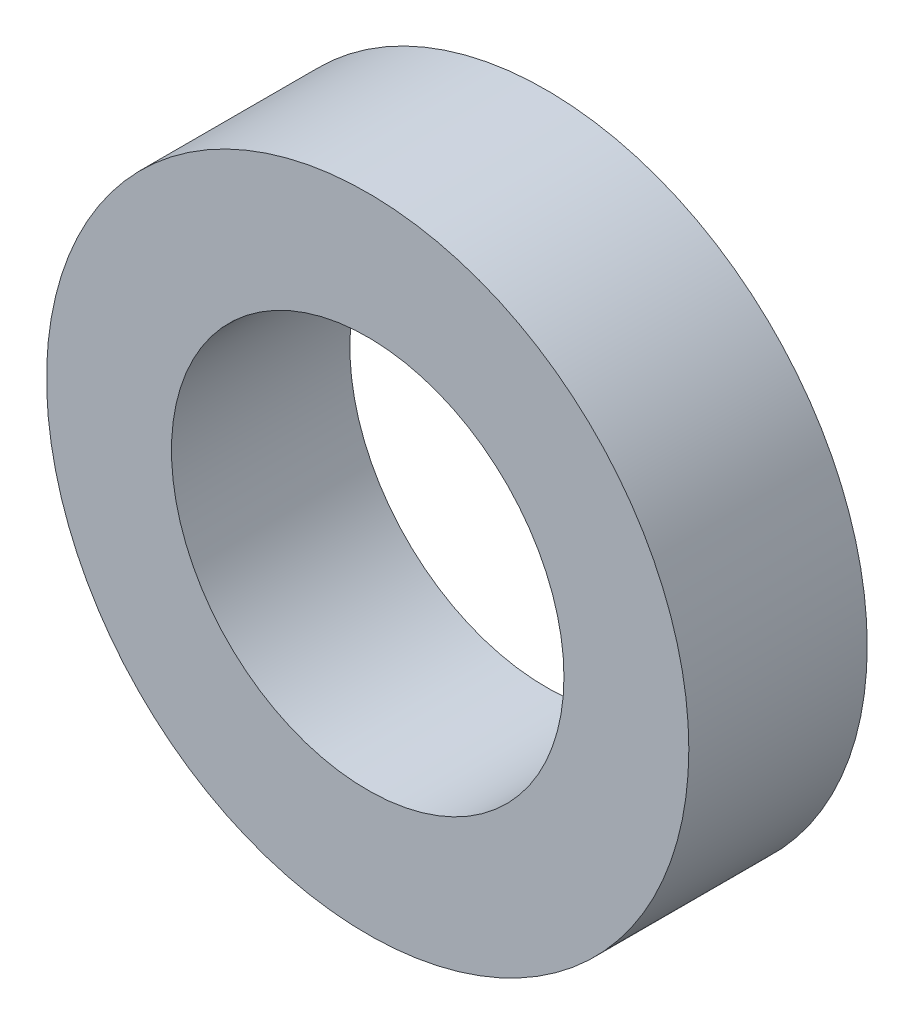
ISO-10303-21;
HEADER;
FILE_DESCRIPTION(('STEP AP214'),'2;1');
FILE_NAME('part.step','',(''),(''),'','','');
FILE_SCHEMA(('AUTOMOTIVE_DESIGN { 1 0 10303 214 1 1 1 1 }'));
ENDSEC;
DATA;
#1=APPLICATION_CONTEXT('core data for automotive mechanical design processes');
#2=APPLICATION_PROTOCOL_DEFINITION('international standard','automotive_design',2000,#1);
#3=PRODUCT_CONTEXT('',#1,'mechanical');
#4=PRODUCT('Part','Part','',(#3));
#5=PRODUCT_RELATED_PRODUCT_CATEGORY('part','',(#4));
#6=PRODUCT_DEFINITION_FORMATION('','',#4);
#7=PRODUCT_DEFINITION_CONTEXT('part definition',#1,'design');
#8=PRODUCT_DEFINITION('design','',#6,#7);
#9=PRODUCT_DEFINITION_SHAPE('','',#8);
#10=(LENGTH_UNIT() NAMED_UNIT(*) SI_UNIT(.MILLI.,.METRE.));
#11=(NAMED_UNIT(*) PLANE_ANGLE_UNIT() SI_UNIT($,.RADIAN.));
#12=(NAMED_UNIT(*) SI_UNIT($,.STERADIAN.) SOLID_ANGLE_UNIT());
#13=UNCERTAINTY_MEASURE_WITH_UNIT(LENGTH_MEASURE(1.E-05),#10,'distance_accuracy_value','');
#14=(GEOMETRIC_REPRESENTATION_CONTEXT(3) GLOBAL_UNCERTAINTY_ASSIGNED_CONTEXT((#13)) GLOBAL_UNIT_ASSIGNED_CONTEXT((#10,
#11,#12)) REPRESENTATION_CONTEXT('',''));
#15=CARTESIAN_POINT('',(0.,0.,0.));
#16=DIRECTION('',(0.,0.,1.));
#17=DIRECTION('',(1.,0.,0.));
#18=AXIS2_PLACEMENT_3D('',#15,#16,#17);
#19=CARTESIAN_POINT('',(0.,0.,25.));
#20=DIRECTION('',(0.,0.,1.));
#21=DIRECTION('',(1.,0.,0.));
#22=AXIS2_PLACEMENT_3D('',#19,#20,#21);
#23=PLANE('',#22);
#24=CARTESIAN_POINT('',(0.,0.,25.));
#25=DIRECTION('',(0.,0.,1.));
#26=DIRECTION('',(1.,0.,0.));
#27=AXIS2_PLACEMENT_3D('',#24,#25,#26);
#28=CIRCLE('',#27,45.);
#29=CARTESIAN_POINT('',(45.,0.,25.));
#30=VERTEX_POINT('',#29);
#31=EDGE_CURVE('E10',#30,#30,#28,.T.);
#32=ORIENTED_EDGE('',*,*,#31,.T.);
#33=EDGE_LOOP('',(#32));
#34=FACE_BOUND('',#33,.T.);
#35=CARTESIAN_POINT('',(0.,0.,25.));
#36=DIRECTION('',(0.,0.,1.));
#37=DIRECTION('',(1.,0.,0.));
#38=AXIS2_PLACEMENT_3D('',#35,#36,#37);
#39=CIRCLE('',#38,27.5);
#40=CARTESIAN_POINT('',(27.5,0.,25.));
#41=VERTEX_POINT('',#40);
#42=EDGE_CURVE('E50',#41,#41,#39,.T.);
#43=ORIENTED_EDGE('',*,*,#42,.F.);
#44=EDGE_LOOP('',(#43));
#45=FACE_BOUND('',#44,.T.);
#46=ADVANCED_FACE('F37',(#34,#45),#23,.T.);
#47=CARTESIAN_POINT('',(0.,0.,0.));
#48=DIRECTION('',(0.,0.,1.));
#49=DIRECTION('',(1.,0.,0.));
#50=AXIS2_PLACEMENT_3D('',#47,#48,#49);
#51=PLANE('',#50);
#52=CARTESIAN_POINT('',(0.,0.,0.));
#53=DIRECTION('',(0.,0.,1.));
#54=DIRECTION('',(1.,0.,0.));
#55=AXIS2_PLACEMENT_3D('',#52,#53,#54);
#56=CIRCLE('',#55,45.);
#57=CARTESIAN_POINT('',(45.,0.,0.));
#58=VERTEX_POINT('',#57);
#59=EDGE_CURVE('E41',#58,#58,#56,.T.);
#60=ORIENTED_EDGE('',*,*,#59,.F.);
#61=EDGE_LOOP('',(#60));
#62=FACE_BOUND('',#61,.T.);
#63=CARTESIAN_POINT('',(0.,0.,0.));
#64=DIRECTION('',(0.,0.,1.));
#65=DIRECTION('',(1.,0.,0.));
#66=AXIS2_PLACEMENT_3D('',#63,#64,#65);
#67=CIRCLE('',#66,27.5);
#68=CARTESIAN_POINT('',(27.5,0.,0.));
#69=VERTEX_POINT('',#68);
#70=EDGE_CURVE('E52',#69,#69,#67,.T.);
#71=ORIENTED_EDGE('',*,*,#70,.T.);
#72=EDGE_LOOP('',(#71));
#73=FACE_BOUND('',#72,.T.);
#74=ADVANCED_FACE('F64',(#62,#73),#51,.F.);
#75=CARTESIAN_POINT('',(0.,0.,25.));
#76=DIRECTION('',(0.,0.,-1.));
#77=DIRECTION('',(-1.,0.,0.));
#78=AXIS2_PLACEMENT_3D('',#75,#76,#77);
#79=CYLINDRICAL_SURFACE('',#78,45.);
#80=ORIENTED_EDGE('',*,*,#31,.F.);
#81=EDGE_LOOP('',(#80));
#82=FACE_BOUND('',#81,.T.);
#83=ORIENTED_EDGE('',*,*,#59,.T.);
#84=EDGE_LOOP('',(#83));
#85=FACE_BOUND('',#84,.T.);
#86=ADVANCED_FACE('F39',(#82,#85),#79,.T.);
#87=CARTESIAN_POINT('',(0.,0.,25.));
#88=DIRECTION('',(0.,0.,-1.));
#89=DIRECTION('',(-1.,0.,0.));
#90=AXIS2_PLACEMENT_3D('',#87,#88,#89);
#91=CYLINDRICAL_SURFACE('',#90,27.5);
#92=ORIENTED_EDGE('',*,*,#42,.T.);
#93=EDGE_LOOP('',(#92));
#94=FACE_BOUND('',#93,.T.);
#95=ORIENTED_EDGE('',*,*,#70,.F.);
#96=EDGE_LOOP('',(#95));
#97=FACE_BOUND('',#96,.T.);
#98=ADVANCED_FACE('F60',(#94,#97),#91,.F.);
#99=CLOSED_SHELL('',(#46,#74,#86,#98));
#100=MANIFOLD_SOLID_BREP('B2',#99);
#101=ADVANCED_BREP_SHAPE_REPRESENTATION('',(#18,#100),#14);
#102=SHAPE_DEFINITION_REPRESENTATION(#9,#101);
ENDSEC;
END-ISO-10303-21;
